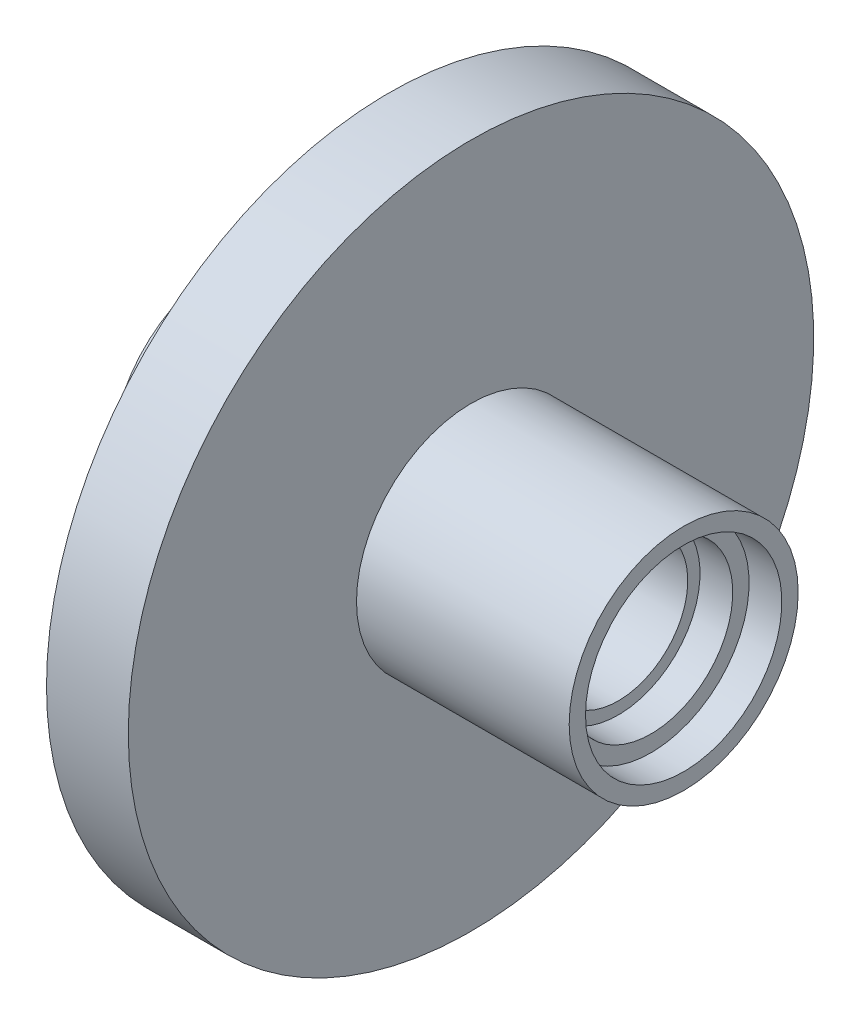
ISO-10303-21;
HEADER;
FILE_DESCRIPTION(('STEP AP214'),'2;1');
FILE_NAME('part.step','',(''),(''),'','','');
FILE_SCHEMA(('AUTOMOTIVE_DESIGN { 1 0 10303 214 1 1 1 1 }'));
ENDSEC;
DATA;
#1=APPLICATION_CONTEXT('core data for automotive mechanical design processes');
#2=APPLICATION_PROTOCOL_DEFINITION('international standard','automotive_design',2000,#1);
#3=PRODUCT_CONTEXT('',#1,'mechanical');
#4=PRODUCT('Part','Part','',(#3));
#5=PRODUCT_RELATED_PRODUCT_CATEGORY('part','',(#4));
#6=PRODUCT_DEFINITION_FORMATION('','',#4);
#7=PRODUCT_DEFINITION_CONTEXT('part definition',#1,'design');
#8=PRODUCT_DEFINITION('design','',#6,#7);
#9=PRODUCT_DEFINITION_SHAPE('','',#8);
#10=(LENGTH_UNIT() NAMED_UNIT(*) SI_UNIT(.MILLI.,.METRE.));
#11=(NAMED_UNIT(*) PLANE_ANGLE_UNIT() SI_UNIT($,.RADIAN.));
#12=(NAMED_UNIT(*) SI_UNIT($,.STERADIAN.) SOLID_ANGLE_UNIT());
#13=UNCERTAINTY_MEASURE_WITH_UNIT(LENGTH_MEASURE(1.E-05),#10,'distance_accuracy_value','');
#14=(GEOMETRIC_REPRESENTATION_CONTEXT(3) GLOBAL_UNCERTAINTY_ASSIGNED_CONTEXT((#13)) GLOBAL_UNIT_ASSIGNED_CONTEXT((#10,
#11,#12)) REPRESENTATION_CONTEXT('',''));
#15=CARTESIAN_POINT('',(0.,0.,0.));
#16=DIRECTION('',(0.,0.,1.));
#17=DIRECTION('',(1.,0.,0.));
#18=AXIS2_PLACEMENT_3D('',#15,#16,#17);
#19=CARTESIAN_POINT('',(0.,0.,0.));
#20=DIRECTION('',(-1.,0.,0.));
#21=DIRECTION('',(0.,0.,1.));
#22=AXIS2_PLACEMENT_3D('',#19,#20,#21);
#23=CYLINDRICAL_SURFACE('',#22,6.00000000000003);
#24=CARTESIAN_POINT('',(-10.5,0.,0.));
#25=DIRECTION('',(-1.,0.,0.));
#26=DIRECTION('',(0.,0.,1.));
#27=AXIS2_PLACEMENT_3D('',#24,#25,#26);
#28=CIRCLE('',#27,6.00000000000003);
#29=CARTESIAN_POINT('',(-10.5,0.,6.00000000000003));
#30=VERTEX_POINT('',#29);
#31=EDGE_CURVE('E10',#30,#30,#28,.T.);
#32=ORIENTED_EDGE('',*,*,#31,.F.);
#33=EDGE_LOOP('',(#32));
#34=FACE_BOUND('',#33,.T.);
#35=CARTESIAN_POINT('',(-12.5,0.,0.));
#36=DIRECTION('',(-1.,0.,0.));
#37=DIRECTION('',(0.,0.,1.));
#38=AXIS2_PLACEMENT_3D('',#35,#36,#37);
#39=CIRCLE('',#38,6.00000000000003);
#40=CARTESIAN_POINT('',(-12.5,0.,6.00000000000003));
#41=VERTEX_POINT('',#40);
#42=EDGE_CURVE('E92',#41,#41,#39,.T.);
#43=ORIENTED_EDGE('',*,*,#42,.T.);
#44=EDGE_LOOP('',(#43));
#45=FACE_BOUND('',#44,.T.);
#46=ADVANCED_FACE('F34',(#34,#45),#23,.F.);
#47=CARTESIAN_POINT('',(-10.5,0.,0.));
#48=DIRECTION('',(1.,0.,0.));
#49=DIRECTION('',(0.,0.,-1.));
#50=AXIS2_PLACEMENT_3D('',#47,#48,#49);
#51=PLANE('',#50);
#52=CARTESIAN_POINT('',(-10.5,0.,0.));
#53=DIRECTION('',(-1.,0.,0.));
#54=DIRECTION('',(0.,0.,1.));
#55=AXIS2_PLACEMENT_3D('',#52,#53,#54);
#56=CIRCLE('',#55,4.99999999999967);
#57=CARTESIAN_POINT('',(-10.5,0.,4.99999999999967));
#58=VERTEX_POINT('',#57);
#59=EDGE_CURVE('E40',#58,#58,#56,.T.);
#60=ORIENTED_EDGE('',*,*,#59,.F.);
#61=EDGE_LOOP('',(#60));
#62=FACE_BOUND('',#61,.T.);
#63=ORIENTED_EDGE('',*,*,#31,.T.);
#64=EDGE_LOOP('',(#63));
#65=FACE_BOUND('',#64,.T.);
#66=ADVANCED_FACE('F156',(#62,#65),#51,.F.);
#67=CARTESIAN_POINT('',(0.,0.,0.));
#68=DIRECTION('',(-1.,0.,0.));
#69=DIRECTION('',(0.,0.,1.));
#70=AXIS2_PLACEMENT_3D('',#67,#68,#69);
#71=CYLINDRICAL_SURFACE('',#70,4.99999999999967);
#72=CARTESIAN_POINT('',(-8.5,0.,0.));
#73=DIRECTION('',(-1.,0.,0.));
#74=DIRECTION('',(0.,0.,1.));
#75=AXIS2_PLACEMENT_3D('',#72,#73,#74);
#76=CIRCLE('',#75,4.99999999999967);
#77=CARTESIAN_POINT('',(-8.5,0.,4.99999999999967));
#78=VERTEX_POINT('',#77);
#79=EDGE_CURVE('E44',#78,#78,#76,.T.);
#80=ORIENTED_EDGE('',*,*,#79,.F.);
#81=EDGE_LOOP('',(#80));
#82=FACE_BOUND('',#81,.T.);
#83=ORIENTED_EDGE('',*,*,#59,.T.);
#84=EDGE_LOOP('',(#83));
#85=FACE_BOUND('',#84,.T.);
#86=ADVANCED_FACE('F161',(#82,#85),#71,.F.);
#87=CARTESIAN_POINT('',(-8.5,0.,0.));
#88=DIRECTION('',(1.,0.,0.));
#89=DIRECTION('',(0.,0.,-1.));
#90=AXIS2_PLACEMENT_3D('',#87,#88,#89);
#91=PLANE('',#90);
#92=CARTESIAN_POINT('',(-8.5,0.,0.));
#93=DIRECTION('',(-1.,0.,0.));
#94=DIRECTION('',(0.,0.,1.));
#95=AXIS2_PLACEMENT_3D('',#92,#93,#94);
#96=CIRCLE('',#95,4.25);
#97=CARTESIAN_POINT('',(-8.5,0.,4.25));
#98=VERTEX_POINT('',#97);
#99=EDGE_CURVE('E48',#98,#98,#96,.T.);
#100=ORIENTED_EDGE('',*,*,#99,.F.);
#101=EDGE_LOOP('',(#100));
#102=FACE_BOUND('',#101,.T.);
#103=ORIENTED_EDGE('',*,*,#79,.T.);
#104=EDGE_LOOP('',(#103));
#105=FACE_BOUND('',#104,.T.);
#106=ADVANCED_FACE('F344',(#102,#105),#91,.F.);
#107=CARTESIAN_POINT('',(0.,0.,0.));
#108=DIRECTION('',(-1.,0.,0.));
#109=DIRECTION('',(0.,0.,1.));
#110=AXIS2_PLACEMENT_3D('',#107,#108,#109);
#111=CYLINDRICAL_SURFACE('',#110,4.25);
#112=CARTESIAN_POINT('',(11.5,0.,0.));
#113=DIRECTION('',(-1.,0.,0.));
#114=DIRECTION('',(0.,0.,1.));
#115=AXIS2_PLACEMENT_3D('',#112,#113,#114);
#116=CIRCLE('',#115,4.25);
#117=CARTESIAN_POINT('',(11.5,0.,4.25));
#118=VERTEX_POINT('',#117);
#119=EDGE_CURVE('E53',#118,#118,#116,.T.);
#120=ORIENTED_EDGE('',*,*,#119,.F.);
#121=EDGE_LOOP('',(#120));
#122=FACE_BOUND('',#121,.T.);
#123=ORIENTED_EDGE('',*,*,#99,.T.);
#124=EDGE_LOOP('',(#123));
#125=FACE_BOUND('',#124,.T.);
#126=ADVANCED_FACE('F334',(#122,#125),#111,.F.);
#127=CARTESIAN_POINT('',(11.5,0.,0.));
#128=DIRECTION('',(1.,0.,0.));
#129=DIRECTION('',(0.,0.,-1.));
#130=AXIS2_PLACEMENT_3D('',#127,#128,#129);
#131=PLANE('',#130);
#132=ORIENTED_EDGE('',*,*,#119,.T.);
#133=EDGE_LOOP('',(#132));
#134=FACE_BOUND('',#133,.T.);
#135=CARTESIAN_POINT('',(11.5,0.,0.));
#136=DIRECTION('',(-1.,0.,0.));
#137=DIRECTION('',(0.,0.,1.));
#138=AXIS2_PLACEMENT_3D('',#135,#136,#137);
#139=CIRCLE('',#138,5.00000000000039);
#140=CARTESIAN_POINT('',(11.5,0.,5.00000000000039));
#141=VERTEX_POINT('',#140);
#142=EDGE_CURVE('E56',#141,#141,#139,.T.);
#143=ORIENTED_EDGE('',*,*,#142,.F.);
#144=EDGE_LOOP('',(#143));
#145=FACE_BOUND('',#144,.T.);
#146=ADVANCED_FACE('F324',(#134,#145),#131,.T.);
#147=CARTESIAN_POINT('',(0.,0.,0.));
#148=DIRECTION('',(-1.,0.,0.));
#149=DIRECTION('',(0.,0.,1.));
#150=AXIS2_PLACEMENT_3D('',#147,#148,#149);
#151=CYLINDRICAL_SURFACE('',#150,5.00000000000039);
#152=ORIENTED_EDGE('',*,*,#142,.T.);
#153=EDGE_LOOP('',(#152));
#154=FACE_BOUND('',#153,.T.);
#155=CARTESIAN_POINT('',(13.5,0.,0.));
#156=DIRECTION('',(-1.,0.,0.));
#157=DIRECTION('',(0.,0.,1.));
#158=AXIS2_PLACEMENT_3D('',#155,#156,#157);
#159=CIRCLE('',#158,5.00000000000039);
#160=CARTESIAN_POINT('',(13.5,0.,5.00000000000039));
#161=VERTEX_POINT('',#160);
#162=EDGE_CURVE('E59',#161,#161,#159,.T.);
#163=ORIENTED_EDGE('',*,*,#162,.F.);
#164=EDGE_LOOP('',(#163));
#165=FACE_BOUND('',#164,.T.);
#166=ADVANCED_FACE('F314',(#154,#165),#151,.F.);
#167=CARTESIAN_POINT('',(13.5,0.,0.));
#168=DIRECTION('',(-1.,0.,0.));
#169=DIRECTION('',(0.,0.,1.));
#170=AXIS2_PLACEMENT_3D('',#167,#168,#169);
#171=PLANE('',#170);
#172=CARTESIAN_POINT('',(13.5,0.,0.));
#173=DIRECTION('',(-1.,0.,0.));
#174=DIRECTION('',(0.,0.,1.));
#175=AXIS2_PLACEMENT_3D('',#172,#173,#174);
#176=CIRCLE('',#175,6.00000000000003);
#177=CARTESIAN_POINT('',(13.5,0.,6.00000000000003));
#178=VERTEX_POINT('',#177);
#179=EDGE_CURVE('E62',#178,#178,#176,.T.);
#180=ORIENTED_EDGE('',*,*,#179,.F.);
#181=EDGE_LOOP('',(#180));
#182=FACE_BOUND('',#181,.T.);
#183=ORIENTED_EDGE('',*,*,#162,.T.);
#184=EDGE_LOOP('',(#183));
#185=FACE_BOUND('',#184,.T.);
#186=ADVANCED_FACE('F304',(#182,#185),#171,.F.);
#187=CARTESIAN_POINT('',(0.,0.,0.));
#188=DIRECTION('',(-1.,0.,0.));
#189=DIRECTION('',(0.,0.,1.));
#190=AXIS2_PLACEMENT_3D('',#187,#188,#189);
#191=CYLINDRICAL_SURFACE('',#190,6.00000000000003);
#192=ORIENTED_EDGE('',*,*,#179,.T.);
#193=EDGE_LOOP('',(#192));
#194=FACE_BOUND('',#193,.T.);
#195=CARTESIAN_POINT('',(15.5,0.,0.));
#196=DIRECTION('',(-1.,0.,0.));
#197=DIRECTION('',(0.,0.,1.));
#198=AXIS2_PLACEMENT_3D('',#195,#196,#197);
#199=CIRCLE('',#198,6.00000000000003);
#200=CARTESIAN_POINT('',(15.5,0.,6.00000000000003));
#201=VERTEX_POINT('',#200);
#202=EDGE_CURVE('E65',#201,#201,#199,.T.);
#203=ORIENTED_EDGE('',*,*,#202,.F.);
#204=EDGE_LOOP('',(#203));
#205=FACE_BOUND('',#204,.T.);
#206=ADVANCED_FACE('F294',(#194,#205),#191,.F.);
#207=CARTESIAN_POINT('',(15.5,0.,0.));
#208=DIRECTION('',(1.,0.,0.));
#209=DIRECTION('',(0.,0.,-1.));
#210=AXIS2_PLACEMENT_3D('',#207,#208,#209);
#211=PLANE('',#210);
#212=ORIENTED_EDGE('',*,*,#202,.T.);
#213=EDGE_LOOP('',(#212));
#214=FACE_BOUND('',#213,.T.);
#215=CARTESIAN_POINT('',(15.5,0.,0.));
#216=DIRECTION('',(-1.,0.,0.));
#217=DIRECTION('',(0.,0.,1.));
#218=AXIS2_PLACEMENT_3D('',#215,#216,#217);
#219=CIRCLE('',#218,7.);
#220=CARTESIAN_POINT('',(15.5,0.,7.));
#221=VERTEX_POINT('',#220);
#222=EDGE_CURVE('E68',#221,#221,#219,.T.);
#223=ORIENTED_EDGE('',*,*,#222,.F.);
#224=EDGE_LOOP('',(#223));
#225=FACE_BOUND('',#224,.T.);
#226=ADVANCED_FACE('F284',(#214,#225),#211,.T.);
#227=CARTESIAN_POINT('',(0.,0.,0.));
#228=DIRECTION('',(-1.,0.,0.));
#229=DIRECTION('',(0.,0.,1.));
#230=AXIS2_PLACEMENT_3D('',#227,#228,#229);
#231=CYLINDRICAL_SURFACE('',#230,7.);
#232=CARTESIAN_POINT('',(2.5,0.,0.));
#233=DIRECTION('',(-1.,0.,0.));
#234=DIRECTION('',(0.,0.,1.));
#235=AXIS2_PLACEMENT_3D('',#232,#233,#234);
#236=CIRCLE('',#235,7.);
#237=CARTESIAN_POINT('',(2.5,0.,7.));
#238=VERTEX_POINT('',#237);
#239=EDGE_CURVE('E71',#238,#238,#236,.T.);
#240=ORIENTED_EDGE('',*,*,#239,.F.);
#241=EDGE_LOOP('',(#240));
#242=FACE_BOUND('',#241,.T.);
#243=ORIENTED_EDGE('',*,*,#222,.T.);
#244=EDGE_LOOP('',(#243));
#245=FACE_BOUND('',#244,.T.);
#246=ADVANCED_FACE('F273',(#242,#245),#231,.T.);
#247=CARTESIAN_POINT('',(2.5,0.,0.));
#248=DIRECTION('',(1.,0.,0.));
#249=DIRECTION('',(0.,0.,-1.));
#250=AXIS2_PLACEMENT_3D('',#247,#248,#249);
#251=PLANE('',#250);
#252=ORIENTED_EDGE('',*,*,#239,.T.);
#253=EDGE_LOOP('',(#252));
#254=FACE_BOUND('',#253,.T.);
#255=CARTESIAN_POINT('',(2.5,0.,0.));
#256=DIRECTION('',(-1.,0.,0.));
#257=DIRECTION('',(0.,0.,1.));
#258=AXIS2_PLACEMENT_3D('',#255,#256,#257);
#259=CIRCLE('',#258,20.95);
#260=CARTESIAN_POINT('',(2.5,0.,20.95));
#261=VERTEX_POINT('',#260);
#262=EDGE_CURVE('E74',#261,#261,#259,.T.);
#263=ORIENTED_EDGE('',*,*,#262,.F.);
#264=EDGE_LOOP('',(#263));
#265=FACE_BOUND('',#264,.T.);
#266=ADVANCED_FACE('F263',(#254,#265),#251,.T.);
#267=CARTESIAN_POINT('',(0.,0.,0.));
#268=DIRECTION('',(-1.,0.,0.));
#269=DIRECTION('',(0.,0.,1.));
#270=AXIS2_PLACEMENT_3D('',#267,#268,#269);
#271=CYLINDRICAL_SURFACE('',#270,20.95);
#272=ORIENTED_EDGE('',*,*,#262,.T.);
#273=EDGE_LOOP('',(#272));
#274=FACE_BOUND('',#273,.T.);
#275=CARTESIAN_POINT('',(-2.5,0.,0.));
#276=DIRECTION('',(-1.,0.,0.));
#277=DIRECTION('',(0.,0.,1.));
#278=AXIS2_PLACEMENT_3D('',#275,#276,#277);
#279=CIRCLE('',#278,20.95);
#280=CARTESIAN_POINT('',(-2.5,0.,20.95));
#281=VERTEX_POINT('',#280);
#282=EDGE_CURVE('E77',#281,#281,#279,.T.);
#283=ORIENTED_EDGE('',*,*,#282,.F.);
#284=EDGE_LOOP('',(#283));
#285=FACE_BOUND('',#284,.T.);
#286=ADVANCED_FACE('F152',(#274,#285),#271,.T.);
#287=CARTESIAN_POINT('',(-2.5,0.,0.));
#288=DIRECTION('',(1.,0.,0.));
#289=DIRECTION('',(0.,0.,-1.));
#290=AXIS2_PLACEMENT_3D('',#287,#288,#289);
#291=PLANE('',#290);
#292=CARTESIAN_POINT('',(-2.5,0.,0.));
#293=DIRECTION('',(-1.,0.,0.));
#294=DIRECTION('',(0.,0.,1.));
#295=AXIS2_PLACEMENT_3D('',#292,#293,#294);
#296=CIRCLE('',#295,16.5);
#297=CARTESIAN_POINT('',(-2.5,0.,16.5));
#298=VERTEX_POINT('',#297);
#299=EDGE_CURVE('E80',#298,#298,#296,.T.);
#300=ORIENTED_EDGE('',*,*,#299,.F.);
#301=EDGE_LOOP('',(#300));
#302=FACE_BOUND('',#301,.T.);
#303=ORIENTED_EDGE('',*,*,#282,.T.);
#304=EDGE_LOOP('',(#303));
#305=FACE_BOUND('',#304,.T.);
#306=ADVANCED_FACE('F146',(#302,#305),#291,.F.);
#307=CARTESIAN_POINT('',(0.,0.,0.));
#308=DIRECTION('',(-1.,0.,0.));
#309=DIRECTION('',(0.,0.,1.));
#310=AXIS2_PLACEMENT_3D('',#307,#308,#309);
#311=CYLINDRICAL_SURFACE('',#310,16.5);
#312=ORIENTED_EDGE('',*,*,#299,.T.);
#313=EDGE_LOOP('',(#312));
#314=FACE_BOUND('',#313,.T.);
#315=CARTESIAN_POINT('',(-5.,0.,0.));
#316=DIRECTION('',(-1.,0.,0.));
#317=DIRECTION('',(0.,0.,1.));
#318=AXIS2_PLACEMENT_3D('',#315,#316,#317);
#319=CIRCLE('',#318,16.5);
#320=CARTESIAN_POINT('',(-5.,0.,16.5));
#321=VERTEX_POINT('',#320);
#322=EDGE_CURVE('E83',#321,#321,#319,.T.);
#323=ORIENTED_EDGE('',*,*,#322,.F.);
#324=EDGE_LOOP('',(#323));
#325=FACE_BOUND('',#324,.T.);
#326=ADVANCED_FACE('F133',(#314,#325),#311,.T.);
#327=CARTESIAN_POINT('',(-5.,0.,0.));
#328=DIRECTION('',(1.,0.,0.));
#329=DIRECTION('',(0.,0.,-1.));
#330=AXIS2_PLACEMENT_3D('',#327,#328,#329);
#331=PLANE('',#330);
#332=CARTESIAN_POINT('',(-5.,9.1923881554251,-9.19238815542514));
#333=DIRECTION('',(-1.,0.,0.));
#334=DIRECTION('',(0.,1.,0.));
#335=AXIS2_PLACEMENT_3D('',#332,#333,#334);
#336=CIRCLE('',#335,1.25);
#337=CARTESIAN_POINT('',(-5.,10.4423881554251,-9.19238815542514));
#338=VERTEX_POINT('',#337);
#339=EDGE_CURVE('E114',#338,#338,#336,.T.);
#340=ORIENTED_EDGE('',*,*,#339,.F.);
#341=EDGE_LOOP('',(#340));
#342=FACE_BOUND('',#341,.T.);
#343=CARTESIAN_POINT('',(-5.,-9.1923881554251,-9.19238815542514));
#344=DIRECTION('',(-1.,0.,0.));
#345=DIRECTION('',(0.,0.,-1.));
#346=AXIS2_PLACEMENT_3D('',#343,#344,#345);
#347=CIRCLE('',#346,1.25);
#348=CARTESIAN_POINT('',(-5.,-9.1923881554251,-10.4423881554251));
#349=VERTEX_POINT('',#348);
#350=EDGE_CURVE('E108',#349,#349,#347,.T.);
#351=ORIENTED_EDGE('',*,*,#350,.F.);
#352=EDGE_LOOP('',(#351));
#353=FACE_BOUND('',#352,.T.);
#354=CARTESIAN_POINT('',(-5.,-9.19238815542504,9.1923881554252));
#355=DIRECTION('',(-1.,0.,0.));
#356=DIRECTION('',(0.,-1.,0.));
#357=AXIS2_PLACEMENT_3D('',#354,#355,#356);
#358=CIRCLE('',#357,1.25);
#359=CARTESIAN_POINT('',(-5.,-10.442388155425,9.19238815542521));
#360=VERTEX_POINT('',#359);
#361=EDGE_CURVE('E102',#360,#360,#358,.T.);
#362=ORIENTED_EDGE('',*,*,#361,.F.);
#363=EDGE_LOOP('',(#362));
#364=FACE_BOUND('',#363,.T.);
#365=CARTESIAN_POINT('',(-5.,9.1923881554251,9.19238815542514));
#366=DIRECTION('',(-1.,0.,0.));
#367=DIRECTION('',(0.,0.,1.));
#368=AXIS2_PLACEMENT_3D('',#365,#366,#367);
#369=CIRCLE('',#368,1.25);
#370=CARTESIAN_POINT('',(-5.,9.1923881554251,10.4423881554251));
#371=VERTEX_POINT('',#370);
#372=EDGE_CURVE('E96',#371,#371,#369,.T.);
#373=ORIENTED_EDGE('',*,*,#372,.F.);
#374=EDGE_LOOP('',(#373));
#375=FACE_BOUND('',#374,.T.);
#376=CARTESIAN_POINT('',(-5.,0.,0.));
#377=DIRECTION('',(-1.,0.,0.));
#378=DIRECTION('',(0.,0.,1.));
#379=AXIS2_PLACEMENT_3D('',#376,#377,#378);
#380=CIRCLE('',#379,7.);
#381=CARTESIAN_POINT('',(-5.,0.,7.));
#382=VERTEX_POINT('',#381);
#383=EDGE_CURVE('E86',#382,#382,#380,.T.);
#384=ORIENTED_EDGE('',*,*,#383,.F.);
#385=EDGE_LOOP('',(#384));
#386=FACE_BOUND('',#385,.T.);
#387=ORIENTED_EDGE('',*,*,#322,.T.);
#388=EDGE_LOOP('',(#387));
#389=FACE_BOUND('',#388,.T.);
#390=ADVANCED_FACE('F129',(#342,#353,#364,#375,#386,#389),#331,.F.);
#391=CARTESIAN_POINT('',(0.,0.,0.));
#392=DIRECTION('',(-1.,0.,0.));
#393=DIRECTION('',(0.,0.,1.));
#394=AXIS2_PLACEMENT_3D('',#391,#392,#393);
#395=CYLINDRICAL_SURFACE('',#394,7.);
#396=ORIENTED_EDGE('',*,*,#383,.T.);
#397=EDGE_LOOP('',(#396));
#398=FACE_BOUND('',#397,.T.);
#399=CARTESIAN_POINT('',(-12.5,0.,0.));
#400=DIRECTION('',(-1.,0.,0.));
#401=DIRECTION('',(0.,0.,1.));
#402=AXIS2_PLACEMENT_3D('',#399,#400,#401);
#403=CIRCLE('',#402,7.);
#404=CARTESIAN_POINT('',(-12.5,0.,7.));
#405=VERTEX_POINT('',#404);
#406=EDGE_CURVE('E89',#405,#405,#403,.T.);
#407=ORIENTED_EDGE('',*,*,#406,.F.);
#408=EDGE_LOOP('',(#407));
#409=FACE_BOUND('',#408,.T.);
#410=ADVANCED_FACE('F132',(#398,#409),#395,.T.);
#411=CARTESIAN_POINT('',(-12.5,0.,0.));
#412=DIRECTION('',(1.,0.,0.));
#413=DIRECTION('',(0.,0.,-1.));
#414=AXIS2_PLACEMENT_3D('',#411,#412,#413);
#415=PLANE('',#414);
#416=ORIENTED_EDGE('',*,*,#42,.F.);
#417=EDGE_LOOP('',(#416));
#418=FACE_BOUND('',#417,.T.);
#419=ORIENTED_EDGE('',*,*,#406,.T.);
#420=EDGE_LOOP('',(#419));
#421=FACE_BOUND('',#420,.T.);
#422=ADVANCED_FACE('F166',(#418,#421),#415,.F.);
#423=CARTESIAN_POINT('',(0.,9.1923881554251,9.19238815542514));
#424=DIRECTION('',(-1.,0.,0.));
#425=DIRECTION('',(0.,0.,1.));
#426=AXIS2_PLACEMENT_3D('',#423,#424,#425);
#427=CYLINDRICAL_SURFACE('',#426,1.25);
#428=CARTESIAN_POINT('',(0.,9.1923881554251,9.19238815542514));
#429=DIRECTION('',(-1.,0.,0.));
#430=DIRECTION('',(0.,0.,1.));
#431=AXIS2_PLACEMENT_3D('',#428,#429,#430);
#432=CIRCLE('',#431,1.25);
#433=CARTESIAN_POINT('',(0.,9.1923881554251,10.4423881554251));
#434=VERTEX_POINT('',#433);
#435=EDGE_CURVE('E95',#434,#434,#432,.T.);
#436=ORIENTED_EDGE('',*,*,#435,.F.);
#437=EDGE_LOOP('',(#436));
#438=FACE_BOUND('',#437,.T.);
#439=ORIENTED_EDGE('',*,*,#372,.T.);
#440=EDGE_LOOP('',(#439));
#441=FACE_BOUND('',#440,.T.);
#442=ADVANCED_FACE('F169',(#438,#441),#427,.F.);
#443=CARTESIAN_POINT('',(0.,9.1923881554251,9.19238815542514));
#444=DIRECTION('',(-1.,0.,0.));
#445=DIRECTION('',(0.,0.,1.));
#446=AXIS2_PLACEMENT_3D('',#443,#444,#445);
#447=PLANE('',#446);
#448=ORIENTED_EDGE('',*,*,#435,.T.);
#449=EDGE_LOOP('',(#448));
#450=FACE_BOUND('',#449,.T.);
#451=ADVANCED_FACE('F181',(#450),#447,.T.);
#452=CARTESIAN_POINT('',(0.,-9.19238815542504,9.1923881554252));
#453=DIRECTION('',(-1.,0.,0.));
#454=DIRECTION('',(0.,0.,1.));
#455=AXIS2_PLACEMENT_3D('',#452,#453,#454);
#456=CYLINDRICAL_SURFACE('',#455,1.25);
#457=CARTESIAN_POINT('',(0.,-9.19238815542504,9.1923881554252));
#458=DIRECTION('',(-1.,0.,0.));
#459=DIRECTION('',(0.,-1.,0.));
#460=AXIS2_PLACEMENT_3D('',#457,#458,#459);
#461=CIRCLE('',#460,1.25);
#462=CARTESIAN_POINT('',(0.,-10.442388155425,9.19238815542521));
#463=VERTEX_POINT('',#462);
#464=EDGE_CURVE('E105',#463,#463,#461,.T.);
#465=ORIENTED_EDGE('',*,*,#464,.F.);
#466=EDGE_LOOP('',(#465));
#467=FACE_BOUND('',#466,.T.);
#468=ORIENTED_EDGE('',*,*,#361,.T.);
#469=EDGE_LOOP('',(#468));
#470=FACE_BOUND('',#469,.T.);
#471=ADVANCED_FACE('F185',(#467,#470),#456,.F.);
#472=CARTESIAN_POINT('',(0.,-9.19238815542504,9.1923881554252));
#473=DIRECTION('',(-1.,0.,0.));
#474=DIRECTION('',(0.,-1.,0.));
#475=AXIS2_PLACEMENT_3D('',#472,#473,#474);
#476=PLANE('',#475);
#477=ORIENTED_EDGE('',*,*,#464,.T.);
#478=EDGE_LOOP('',(#477));
#479=FACE_BOUND('',#478,.T.);
#480=ADVANCED_FACE('F189',(#479),#476,.T.);
#481=CARTESIAN_POINT('',(0.,-9.1923881554251,-9.19238815542514));
#482=DIRECTION('',(-1.,0.,0.));
#483=DIRECTION('',(0.,0.,1.));
#484=AXIS2_PLACEMENT_3D('',#481,#482,#483);
#485=CYLINDRICAL_SURFACE('',#484,1.25);
#486=CARTESIAN_POINT('',(0.,-9.1923881554251,-9.19238815542514));
#487=DIRECTION('',(-1.,0.,0.));
#488=DIRECTION('',(0.,0.,-1.));
#489=AXIS2_PLACEMENT_3D('',#486,#487,#488);
#490=CIRCLE('',#489,1.25);
#491=CARTESIAN_POINT('',(0.,-9.1923881554251,-10.4423881554251));
#492=VERTEX_POINT('',#491);
#493=EDGE_CURVE('E111',#492,#492,#490,.T.);
#494=ORIENTED_EDGE('',*,*,#493,.F.);
#495=EDGE_LOOP('',(#494));
#496=FACE_BOUND('',#495,.T.);
#497=ORIENTED_EDGE('',*,*,#350,.T.);
#498=EDGE_LOOP('',(#497));
#499=FACE_BOUND('',#498,.T.);
#500=ADVANCED_FACE('F193',(#496,#499),#485,.F.);
#501=CARTESIAN_POINT('',(0.,-9.1923881554251,-9.19238815542514));
#502=DIRECTION('',(-1.,0.,0.));
#503=DIRECTION('',(0.,0.,-1.));
#504=AXIS2_PLACEMENT_3D('',#501,#502,#503);
#505=PLANE('',#504);
#506=ORIENTED_EDGE('',*,*,#493,.T.);
#507=EDGE_LOOP('',(#506));
#508=FACE_BOUND('',#507,.T.);
#509=ADVANCED_FACE('F125',(#508),#505,.T.);
#510=CARTESIAN_POINT('',(0.,9.1923881554251,-9.19238815542514));
#511=DIRECTION('',(-1.,0.,0.));
#512=DIRECTION('',(0.,0.,1.));
#513=AXIS2_PLACEMENT_3D('',#510,#511,#512);
#514=CYLINDRICAL_SURFACE('',#513,1.25);
#515=CARTESIAN_POINT('',(0.,9.1923881554251,-9.19238815542514));
#516=DIRECTION('',(-1.,0.,0.));
#517=DIRECTION('',(0.,1.,0.));
#518=AXIS2_PLACEMENT_3D('',#515,#516,#517);
#519=CIRCLE('',#518,1.25);
#520=CARTESIAN_POINT('',(0.,10.4423881554251,-9.19238815542514));
#521=VERTEX_POINT('',#520);
#522=EDGE_CURVE('E99',#521,#521,#519,.T.);
#523=ORIENTED_EDGE('',*,*,#522,.F.);
#524=EDGE_LOOP('',(#523));
#525=FACE_BOUND('',#524,.T.);
#526=ORIENTED_EDGE('',*,*,#339,.T.);
#527=EDGE_LOOP('',(#526));
#528=FACE_BOUND('',#527,.T.);
#529=ADVANCED_FACE('F122',(#525,#528),#514,.F.);
#530=CARTESIAN_POINT('',(0.,9.1923881554251,-9.19238815542514));
#531=DIRECTION('',(-1.,0.,0.));
#532=DIRECTION('',(0.,1.,0.));
#533=AXIS2_PLACEMENT_3D('',#530,#531,#532);
#534=PLANE('',#533);
#535=ORIENTED_EDGE('',*,*,#522,.T.);
#536=EDGE_LOOP('',(#535));
#537=FACE_BOUND('',#536,.T.);
#538=ADVANCED_FACE('F120',(#537),#534,.T.);
#539=CLOSED_SHELL('',(#46,#66,#86,#106,#126,#146,#166,#186,#206,#226,#246,#266,#286,#306,#326,
#390,#410,#422,#442,#451,#471,#480,#500,#509,#529,#538));
#540=MANIFOLD_SOLID_BREP('B2',#539);
#541=ADVANCED_BREP_SHAPE_REPRESENTATION('',(#18,#540),#14);
#542=SHAPE_DEFINITION_REPRESENTATION(#9,#541);
ENDSEC;
END-ISO-10303-21;
